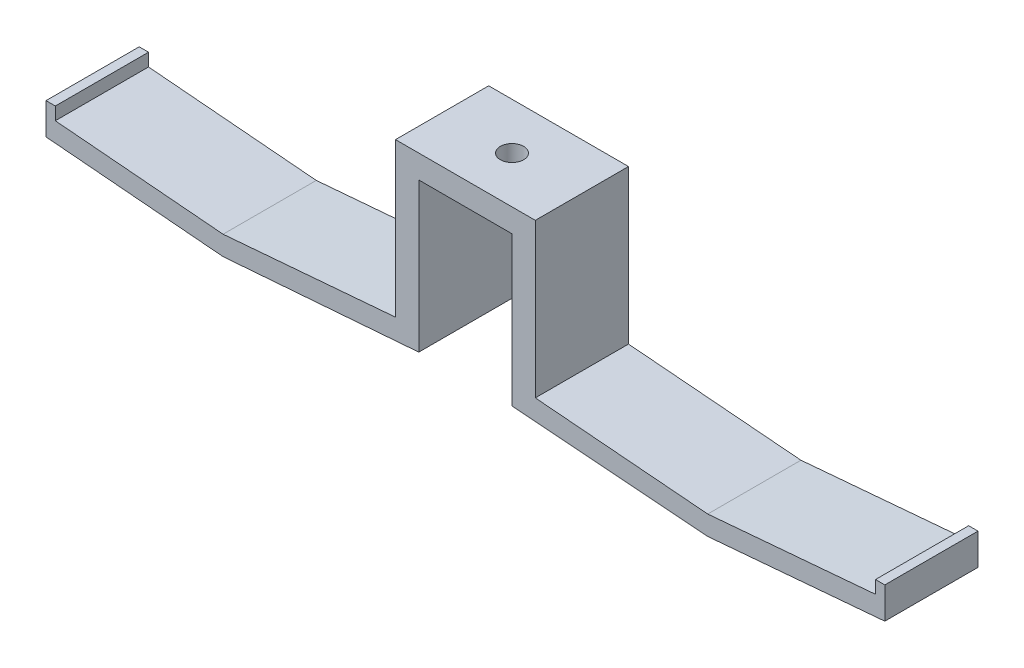
ISO-10303-21;
HEADER;
FILE_DESCRIPTION(('STEP AP214'),'2;1');
FILE_NAME('part.step','',(''),(''),'','','');
FILE_SCHEMA(('AUTOMOTIVE_DESIGN { 1 0 10303 214 1 1 1 1 }'));
ENDSEC;
DATA;
#1=APPLICATION_CONTEXT('core data for automotive mechanical design processes');
#2=APPLICATION_PROTOCOL_DEFINITION('international standard','automotive_design',2000,#1);
#3=PRODUCT_CONTEXT('',#1,'mechanical');
#4=PRODUCT('Part','Part','',(#3));
#5=PRODUCT_RELATED_PRODUCT_CATEGORY('part','',(#4));
#6=PRODUCT_DEFINITION_FORMATION('','',#4);
#7=PRODUCT_DEFINITION_CONTEXT('part definition',#1,'design');
#8=PRODUCT_DEFINITION('design','',#6,#7);
#9=PRODUCT_DEFINITION_SHAPE('','',#8);
#10=(LENGTH_UNIT() NAMED_UNIT(*) SI_UNIT(.MILLI.,.METRE.));
#11=(NAMED_UNIT(*) PLANE_ANGLE_UNIT() SI_UNIT($,.RADIAN.));
#12=(NAMED_UNIT(*) SI_UNIT($,.STERADIAN.) SOLID_ANGLE_UNIT());
#13=UNCERTAINTY_MEASURE_WITH_UNIT(LENGTH_MEASURE(1.E-05),#10,'distance_accuracy_value','');
#14=(GEOMETRIC_REPRESENTATION_CONTEXT(3) GLOBAL_UNCERTAINTY_ASSIGNED_CONTEXT((#13)) GLOBAL_UNIT_ASSIGNED_CONTEXT((#10,
#11,#12)) REPRESENTATION_CONTEXT('',''));
#15=CARTESIAN_POINT('',(0.,0.,0.));
#16=DIRECTION('',(0.,0.,1.));
#17=DIRECTION('',(1.,0.,0.));
#18=AXIS2_PLACEMENT_3D('',#15,#16,#17);
#19=CARTESIAN_POINT('',(-2.81151729848974,-33.7382068524024,25.4));
#20=DIRECTION('',(0.0830454816369341,0.99654575809628,0.));
#21=DIRECTION('',(-0.99654575809628,0.0830454816369341,0.));
#22=AXIS2_PLACEMENT_3D('',#19,#20,#21);
#23=PLANE('',#22);
#24=DIRECTION('',(0.99654575809628,-0.0830454816369341,0.));
#25=VECTOR('',#24,1.);
#26=CARTESIAN_POINT('',(-2.81151729848974,-33.7382068524024,0.));
#27=LINE('',#26,#25);
#28=CARTESIAN_POINT('',(19.05,-35.56,0.));
#29=VERTEX_POINT('',#28);
#30=CARTESIAN_POINT('',(66.04,-39.475833418,0.));
#31=VERTEX_POINT('',#30);
#32=EDGE_CURVE('E202',#29,#31,#27,.T.);
#33=ORIENTED_EDGE('',*,*,#32,.F.);
#34=DIRECTION('',(0.,0.,-1.));
#35=VECTOR('',#34,1.);
#36=CARTESIAN_POINT('',(19.05,-35.56,25.4));
#37=LINE('',#36,#35);
#38=CARTESIAN_POINT('',(19.05,-35.56,25.4));
#39=VERTEX_POINT('',#38);
#40=EDGE_CURVE('E11',#39,#29,#37,.T.);
#41=ORIENTED_EDGE('',*,*,#40,.F.);
#42=DIRECTION('',(0.99654575809628,-0.0830454816369341,0.));
#43=VECTOR('',#42,1.);
#44=CARTESIAN_POINT('',(-2.81151729848974,-33.7382068524024,25.4));
#45=LINE('',#44,#43);
#46=CARTESIAN_POINT('',(66.04,-39.475833418,25.4));
#47=VERTEX_POINT('',#46);
#48=EDGE_CURVE('E252',#39,#47,#45,.T.);
#49=ORIENTED_EDGE('',*,*,#48,.T.);
#50=DIRECTION('',(0.,0.,-1.));
#51=VECTOR('',#50,1.);
#52=CARTESIAN_POINT('',(66.04,-39.475833418,25.4));
#53=LINE('',#52,#51);
#54=EDGE_CURVE('E125',#47,#31,#53,.T.);
#55=ORIENTED_EDGE('',*,*,#54,.T.);
#56=EDGE_LOOP('',(#33,#41,#49,#55));
#57=FACE_BOUND('',#56,.T.);
#58=ADVANCED_FACE('F38',(#57),#23,.T.);
#59=CARTESIAN_POINT('',(19.05,0.,25.4));
#60=DIRECTION('',(1.,0.,0.));
#61=DIRECTION('',(0.,1.,0.));
#62=AXIS2_PLACEMENT_3D('',#59,#60,#61);
#63=PLANE('',#62);
#64=DIRECTION('',(0.,-1.,0.));
#65=VECTOR('',#64,1.);
#66=CARTESIAN_POINT('',(19.05,0.,0.));
#67=LINE('',#66,#65);
#68=CARTESIAN_POINT('',(19.05,6.35,0.));
#69=VERTEX_POINT('',#68);
#70=EDGE_CURVE('E205',#69,#29,#67,.T.);
#71=ORIENTED_EDGE('',*,*,#70,.F.);
#72=DIRECTION('',(0.,0.,-1.));
#73=VECTOR('',#72,1.);
#74=CARTESIAN_POINT('',(19.05,6.35,25.4));
#75=LINE('',#74,#73);
#76=CARTESIAN_POINT('',(19.05,6.35,25.4));
#77=VERTEX_POINT('',#76);
#78=EDGE_CURVE('E46',#77,#69,#75,.T.);
#79=ORIENTED_EDGE('',*,*,#78,.F.);
#80=DIRECTION('',(0.,-1.,0.));
#81=VECTOR('',#80,1.);
#82=CARTESIAN_POINT('',(19.05,0.,25.4));
#83=LINE('',#82,#81);
#84=EDGE_CURVE('E303',#77,#39,#83,.T.);
#85=ORIENTED_EDGE('',*,*,#84,.T.);
#86=ORIENTED_EDGE('',*,*,#40,.T.);
#87=EDGE_LOOP('',(#71,#79,#85,#86));
#88=FACE_BOUND('',#87,.T.);
#89=ADVANCED_FACE('F302',(#88),#63,.T.);
#90=CARTESIAN_POINT('',(0.,6.35,25.4));
#91=DIRECTION('',(0.,-1.,0.));
#92=DIRECTION('',(1.,0.,0.));
#93=AXIS2_PLACEMENT_3D('',#90,#91,#92);
#94=PLANE('',#93);
#95=CARTESIAN_POINT('',(0.,6.35,12.7));
#96=DIRECTION('',(0.,1.,0.));
#97=DIRECTION('',(-1.,0.,0.));
#98=AXIS2_PLACEMENT_3D('',#95,#96,#97);
#99=CIRCLE('',#98,3.175);
#100=CARTESIAN_POINT('',(-3.17499999999998,6.35,12.7));
#101=VERTEX_POINT('',#100);
#102=EDGE_CURVE('E206',#101,#101,#99,.T.);
#103=ORIENTED_EDGE('',*,*,#102,.F.);
#104=EDGE_LOOP('',(#103));
#105=FACE_BOUND('',#104,.T.);
#106=DIRECTION('',(-1.,0.,0.));
#107=VECTOR('',#106,1.);
#108=CARTESIAN_POINT('',(0.,6.35,0.));
#109=LINE('',#108,#107);
#110=CARTESIAN_POINT('',(-19.05,6.35,0.));
#111=VERTEX_POINT('',#110);
#112=EDGE_CURVE('E209',#69,#111,#109,.T.);
#113=ORIENTED_EDGE('',*,*,#112,.T.);
#114=DIRECTION('',(0.,0.,-1.));
#115=VECTOR('',#114,1.);
#116=CARTESIAN_POINT('',(-19.05,6.35,25.4));
#117=LINE('',#116,#115);
#118=CARTESIAN_POINT('',(-19.05,6.35,25.4));
#119=VERTEX_POINT('',#118);
#120=EDGE_CURVE('E286',#119,#111,#117,.T.);
#121=ORIENTED_EDGE('',*,*,#120,.F.);
#122=DIRECTION('',(-1.,0.,0.));
#123=VECTOR('',#122,1.);
#124=CARTESIAN_POINT('',(0.,6.35,25.4));
#125=LINE('',#124,#123);
#126=EDGE_CURVE('E293',#77,#119,#125,.T.);
#127=ORIENTED_EDGE('',*,*,#126,.F.);
#128=ORIENTED_EDGE('',*,*,#78,.T.);
#129=EDGE_LOOP('',(#113,#121,#127,#128));
#130=FACE_BOUND('',#129,.T.);
#131=ADVANCED_FACE('F291',(#105,#130),#94,.F.);
#132=CARTESIAN_POINT('',(-19.05,0.,25.4));
#133=DIRECTION('',(1.,0.,0.));
#134=DIRECTION('',(0.,1.,0.));
#135=AXIS2_PLACEMENT_3D('',#132,#133,#134);
#136=PLANE('',#135);
#137=DIRECTION('',(0.,-1.,0.));
#138=VECTOR('',#137,1.);
#139=CARTESIAN_POINT('',(-19.05,0.,0.));
#140=LINE('',#139,#138);
#141=CARTESIAN_POINT('',(-19.05,-35.56,0.));
#142=VERTEX_POINT('',#141);
#143=EDGE_CURVE('E211',#111,#142,#140,.T.);
#144=ORIENTED_EDGE('',*,*,#143,.T.);
#145=DIRECTION('',(0.,0.,-1.));
#146=VECTOR('',#145,1.);
#147=CARTESIAN_POINT('',(-19.05,-35.56,25.4));
#148=LINE('',#147,#146);
#149=CARTESIAN_POINT('',(-19.05,-35.56,25.4));
#150=VERTEX_POINT('',#149);
#151=EDGE_CURVE('E283',#150,#142,#148,.T.);
#152=ORIENTED_EDGE('',*,*,#151,.F.);
#153=DIRECTION('',(0.,-1.,0.));
#154=VECTOR('',#153,1.);
#155=CARTESIAN_POINT('',(-19.05,0.,25.4));
#156=LINE('',#155,#154);
#157=EDGE_CURVE('E314',#119,#150,#156,.T.);
#158=ORIENTED_EDGE('',*,*,#157,.F.);
#159=ORIENTED_EDGE('',*,*,#120,.T.);
#160=EDGE_LOOP('',(#144,#152,#158,#159));
#161=FACE_BOUND('',#160,.T.);
#162=ADVANCED_FACE('F404',(#161),#136,.F.);
#163=CARTESIAN_POINT('',(2.81151729848975,-33.7382068524024,25.4));
#164=DIRECTION('',(0.0830454816369343,-0.99654575809628,0.));
#165=DIRECTION('',(0.99654575809628,0.0830454816369343,0.));
#166=AXIS2_PLACEMENT_3D('',#163,#164,#165);
#167=PLANE('',#166);
#168=DIRECTION('',(-0.99654575809628,-0.0830454816369343,0.));
#169=VECTOR('',#168,1.);
#170=CARTESIAN_POINT('',(2.81151729848975,-33.7382068524024,0.));
#171=LINE('',#170,#169);
#172=CARTESIAN_POINT('',(-66.04,-39.475833418,0.));
#173=VERTEX_POINT('',#172);
#174=EDGE_CURVE('E213',#142,#173,#171,.T.);
#175=ORIENTED_EDGE('',*,*,#174,.T.);
#176=DIRECTION('',(0.,0.,-1.));
#177=VECTOR('',#176,1.);
#178=CARTESIAN_POINT('',(-66.04,-39.475833418,25.4));
#179=LINE('',#178,#177);
#180=CARTESIAN_POINT('',(-66.04,-39.475833418,25.4));
#181=VERTEX_POINT('',#180);
#182=EDGE_CURVE('E281',#181,#173,#179,.T.);
#183=ORIENTED_EDGE('',*,*,#182,.F.);
#184=DIRECTION('',(-0.99654575809628,-0.0830454816369343,0.));
#185=VECTOR('',#184,1.);
#186=CARTESIAN_POINT('',(2.81151729848975,-33.7382068524024,25.4));
#187=LINE('',#186,#185);
#188=EDGE_CURVE('E316',#150,#181,#187,.T.);
#189=ORIENTED_EDGE('',*,*,#188,.F.);
#190=ORIENTED_EDGE('',*,*,#151,.T.);
#191=EDGE_LOOP('',(#175,#183,#189,#190));
#192=FACE_BOUND('',#191,.T.);
#193=ADVANCED_FACE('F400',(#192),#167,.F.);
#194=CARTESIAN_POINT('',(-3.83732638278315,-44.8033773383684,25.4));
#195=DIRECTION('',(0.0853357272861369,0.996352253798096,0.));
#196=DIRECTION('',(-0.996352253798096,0.0853357272861369,0.));
#197=AXIS2_PLACEMENT_3D('',#194,#195,#196);
#198=PLANE('',#197);
#199=DIRECTION('',(0.996352253798096,-0.0853357272861369,0.));
#200=VECTOR('',#199,1.);
#201=CARTESIAN_POINT('',(-3.83732638278315,-44.8033773383684,0.));
#202=LINE('',#201,#200);
#203=CARTESIAN_POINT('',(-111.76,-35.56,0.));
#204=VERTEX_POINT('',#203);
#205=EDGE_CURVE('E216',#204,#173,#202,.T.);
#206=ORIENTED_EDGE('',*,*,#205,.F.);
#207=DIRECTION('',(0.,0.,-1.));
#208=VECTOR('',#207,1.);
#209=CARTESIAN_POINT('',(-111.76,-35.56,25.4));
#210=LINE('',#209,#208);
#211=CARTESIAN_POINT('',(-111.76,-35.56,25.4));
#212=VERTEX_POINT('',#211);
#213=EDGE_CURVE('E279',#212,#204,#210,.T.);
#214=ORIENTED_EDGE('',*,*,#213,.F.);
#215=DIRECTION('',(0.996352253798096,-0.0853357272861369,0.));
#216=VECTOR('',#215,1.);
#217=CARTESIAN_POINT('',(-3.83732638278315,-44.8033773383684,25.4));
#218=LINE('',#217,#216);
#219=EDGE_CURVE('E318',#212,#181,#218,.T.);
#220=ORIENTED_EDGE('',*,*,#219,.T.);
#221=ORIENTED_EDGE('',*,*,#182,.T.);
#222=EDGE_LOOP('',(#206,#214,#220,#221));
#223=FACE_BOUND('',#222,.T.);
#224=ADVANCED_FACE('F395',(#223),#198,.T.);
#225=CARTESIAN_POINT('',(-111.76,-8.89676213870077E-13,25.4));
#226=DIRECTION('',(1.,0.,0.));
#227=DIRECTION('',(0.,1.,0.));
#228=AXIS2_PLACEMENT_3D('',#225,#226,#227);
#229=PLANE('',#228);
#230=DIRECTION('',(0.,-1.,0.));
#231=VECTOR('',#230,1.);
#232=CARTESIAN_POINT('',(-111.76,-8.89676213870077E-13,0.));
#233=LINE('',#232,#231);
#234=CARTESIAN_POINT('',(-111.76,-32.073379719,0.));
#235=VERTEX_POINT('',#234);
#236=EDGE_CURVE('E219',#235,#204,#233,.T.);
#237=ORIENTED_EDGE('',*,*,#236,.F.);
#238=DIRECTION('',(0.,0.,-1.));
#239=VECTOR('',#238,1.);
#240=CARTESIAN_POINT('',(-111.76,-32.073379719,25.4));
#241=LINE('',#240,#239);
#242=CARTESIAN_POINT('',(-111.76,-32.073379719,25.4));
#243=VERTEX_POINT('',#242);
#244=EDGE_CURVE('E277',#243,#235,#241,.T.);
#245=ORIENTED_EDGE('',*,*,#244,.F.);
#246=DIRECTION('',(0.,-1.,0.));
#247=VECTOR('',#246,1.);
#248=CARTESIAN_POINT('',(-111.76,-8.89676213870077E-13,25.4));
#249=LINE('',#248,#247);
#250=EDGE_CURVE('E321',#243,#212,#249,.T.);
#251=ORIENTED_EDGE('',*,*,#250,.T.);
#252=ORIENTED_EDGE('',*,*,#213,.T.);
#253=EDGE_LOOP('',(#237,#245,#251,#252));
#254=FACE_BOUND('',#253,.T.);
#255=ADVANCED_FACE('F392',(#254),#229,.T.);
#256=CARTESIAN_POINT('',(0.,-32.073379719,25.4));
#257=DIRECTION('',(0.,1.,0.));
#258=DIRECTION('',(0.,0.,1.));
#259=AXIS2_PLACEMENT_3D('',#256,#257,#258);
#260=PLANE('',#259);
#261=DIRECTION('',(1.,0.,0.));
#262=VECTOR('',#261,1.);
#263=CARTESIAN_POINT('',(0.,-32.073379719,0.));
#264=LINE('',#263,#262);
#265=CARTESIAN_POINT('',(-114.3,-32.073379719,0.));
#266=VERTEX_POINT('',#265);
#267=EDGE_CURVE('E222',#266,#235,#264,.T.);
#268=ORIENTED_EDGE('',*,*,#267,.F.);
#269=DIRECTION('',(0.,0.,-1.));
#270=VECTOR('',#269,1.);
#271=CARTESIAN_POINT('',(-114.3,-32.073379719,25.4));
#272=LINE('',#271,#270);
#273=CARTESIAN_POINT('',(-114.3,-32.073379719,25.4));
#274=VERTEX_POINT('',#273);
#275=EDGE_CURVE('E275',#274,#266,#272,.T.);
#276=ORIENTED_EDGE('',*,*,#275,.F.);
#277=DIRECTION('',(1.,0.,0.));
#278=VECTOR('',#277,1.);
#279=CARTESIAN_POINT('',(0.,-32.073379719,25.4));
#280=LINE('',#279,#278);
#281=EDGE_CURVE('E324',#274,#243,#280,.T.);
#282=ORIENTED_EDGE('',*,*,#281,.T.);
#283=ORIENTED_EDGE('',*,*,#244,.T.);
#284=EDGE_LOOP('',(#268,#276,#282,#283));
#285=FACE_BOUND('',#284,.T.);
#286=ADVANCED_FACE('F388',(#285),#260,.T.);
#287=CARTESIAN_POINT('',(-114.3,0.,25.4));
#288=DIRECTION('',(-1.,0.,0.));
#289=DIRECTION('',(0.,0.,1.));
#290=AXIS2_PLACEMENT_3D('',#287,#288,#289);
#291=PLANE('',#290);
#292=DIRECTION('',(0.,1.,0.));
#293=VECTOR('',#292,1.);
#294=CARTESIAN_POINT('',(-114.3,0.,0.));
#295=LINE('',#294,#293);
#296=CARTESIAN_POINT('',(-114.3,-40.64,0.));
#297=VERTEX_POINT('',#296);
#298=EDGE_CURVE('E225',#297,#266,#295,.T.);
#299=ORIENTED_EDGE('',*,*,#298,.F.);
#300=DIRECTION('',(0.,0.,-1.));
#301=VECTOR('',#300,1.);
#302=CARTESIAN_POINT('',(-114.3,-40.64,25.4));
#303=LINE('',#302,#301);
#304=CARTESIAN_POINT('',(-114.3,-40.64,25.4));
#305=VERTEX_POINT('',#304);
#306=EDGE_CURVE('E273',#305,#297,#303,.T.);
#307=ORIENTED_EDGE('',*,*,#306,.F.);
#308=DIRECTION('',(0.,1.,0.));
#309=VECTOR('',#308,1.);
#310=CARTESIAN_POINT('',(-114.3,0.,25.4));
#311=LINE('',#310,#309);
#312=EDGE_CURVE('E327',#305,#274,#311,.T.);
#313=ORIENTED_EDGE('',*,*,#312,.T.);
#314=ORIENTED_EDGE('',*,*,#275,.T.);
#315=EDGE_LOOP('',(#299,#307,#313,#314));
#316=FACE_BOUND('',#315,.T.);
#317=ADVANCED_FACE('F384',(#316),#291,.T.);
#318=CARTESIAN_POINT('',(-4.28774731270794,-50.0623459199991,25.4));
#319=DIRECTION('',(-0.0853357272861369,-0.996352253798096,0.));
#320=DIRECTION('',(0.996352253798096,-0.0853357272861369,0.));
#321=AXIS2_PLACEMENT_3D('',#318,#319,#320);
#322=PLANE('',#321);
#323=DIRECTION('',(-0.996352253798096,0.085335727286137,0.));
#324=VECTOR('',#323,1.);
#325=CARTESIAN_POINT('',(-4.28774731270794,-50.0623459199991,0.));
#326=LINE('',#325,#324);
#327=CARTESIAN_POINT('',(-66.04,-44.773379719,0.));
#328=VERTEX_POINT('',#327);
#329=EDGE_CURVE('E228',#328,#297,#326,.T.);
#330=ORIENTED_EDGE('',*,*,#329,.F.);
#331=DIRECTION('',(0.,0.,-1.));
#332=VECTOR('',#331,1.);
#333=CARTESIAN_POINT('',(-66.04,-44.773379719,25.4));
#334=LINE('',#333,#332);
#335=CARTESIAN_POINT('',(-66.04,-44.773379719,25.4));
#336=VERTEX_POINT('',#335);
#337=EDGE_CURVE('E271',#336,#328,#334,.T.);
#338=ORIENTED_EDGE('',*,*,#337,.F.);
#339=DIRECTION('',(-0.996352253798096,0.085335727286137,0.));
#340=VECTOR('',#339,1.);
#341=CARTESIAN_POINT('',(-4.28774731270794,-50.0623459199991,25.4));
#342=LINE('',#341,#340);
#343=EDGE_CURVE('E330',#336,#305,#342,.T.);
#344=ORIENTED_EDGE('',*,*,#343,.T.);
#345=ORIENTED_EDGE('',*,*,#306,.T.);
#346=EDGE_LOOP('',(#330,#338,#344,#345));
#347=FACE_BOUND('',#346,.T.);
#348=ADVANCED_FACE('F380',(#347),#322,.T.);
#349=CARTESIAN_POINT('',(3.05463693139705,-39.419154541199,25.4));
#350=DIRECTION('',(0.0772595631880114,-0.997011012926135,0.));
#351=DIRECTION('',(0.997011012926135,0.0772595631880114,0.));
#352=AXIS2_PLACEMENT_3D('',#349,#350,#351);
#353=PLANE('',#352);
#354=DIRECTION('',(-0.997011012926135,-0.0772595631880114,0.));
#355=VECTOR('',#354,1.);
#356=CARTESIAN_POINT('',(3.05463693139705,-39.419154541199,0.));
#357=LINE('',#356,#355);
#358=CARTESIAN_POINT('',(-12.7,-40.64,0.));
#359=VERTEX_POINT('',#358);
#360=EDGE_CURVE('E231',#359,#328,#357,.T.);
#361=ORIENTED_EDGE('',*,*,#360,.F.);
#362=DIRECTION('',(0.,0.,-1.));
#363=VECTOR('',#362,1.);
#364=CARTESIAN_POINT('',(-12.7,-40.64,25.4));
#365=LINE('',#364,#363);
#366=CARTESIAN_POINT('',(-12.7,-40.64,25.4));
#367=VERTEX_POINT('',#366);
#368=EDGE_CURVE('E269',#367,#359,#365,.T.);
#369=ORIENTED_EDGE('',*,*,#368,.F.);
#370=DIRECTION('',(-0.997011012926135,-0.0772595631880114,0.));
#371=VECTOR('',#370,1.);
#372=CARTESIAN_POINT('',(3.05463693139705,-39.419154541199,25.4));
#373=LINE('',#372,#371);
#374=EDGE_CURVE('E333',#367,#336,#373,.T.);
#375=ORIENTED_EDGE('',*,*,#374,.T.);
#376=ORIENTED_EDGE('',*,*,#337,.T.);
#377=EDGE_LOOP('',(#361,#369,#375,#376));
#378=FACE_BOUND('',#377,.T.);
#379=ADVANCED_FACE('F376',(#378),#353,.T.);
#380=CARTESIAN_POINT('',(-12.7,0.,25.4));
#381=DIRECTION('',(1.,0.,0.));
#382=DIRECTION('',(0.,1.,0.));
#383=AXIS2_PLACEMENT_3D('',#380,#381,#382);
#384=PLANE('',#383);
#385=DIRECTION('',(0.,-1.,0.));
#386=VECTOR('',#385,1.);
#387=CARTESIAN_POINT('',(-12.7,0.,0.));
#388=LINE('',#387,#386);
#389=CARTESIAN_POINT('',(-12.7,0.,0.));
#390=VERTEX_POINT('',#389);
#391=EDGE_CURVE('E234',#390,#359,#388,.T.);
#392=ORIENTED_EDGE('',*,*,#391,.F.);
#393=DIRECTION('',(0.,0.,-1.));
#394=VECTOR('',#393,1.);
#395=CARTESIAN_POINT('',(-12.7,0.,25.4));
#396=LINE('',#395,#394);
#397=CARTESIAN_POINT('',(-12.7,0.,25.4));
#398=VERTEX_POINT('',#397);
#399=EDGE_CURVE('E267',#398,#390,#396,.T.);
#400=ORIENTED_EDGE('',*,*,#399,.F.);
#401=DIRECTION('',(0.,-1.,0.));
#402=VECTOR('',#401,1.);
#403=CARTESIAN_POINT('',(-12.7,0.,25.4));
#404=LINE('',#403,#402);
#405=EDGE_CURVE('E336',#398,#367,#404,.T.);
#406=ORIENTED_EDGE('',*,*,#405,.T.);
#407=ORIENTED_EDGE('',*,*,#368,.T.);
#408=EDGE_LOOP('',(#392,#400,#406,#407));
#409=FACE_BOUND('',#408,.T.);
#410=ADVANCED_FACE('F372',(#409),#384,.T.);
#411=CARTESIAN_POINT('',(0.,0.,25.4));
#412=DIRECTION('',(0.,-1.,0.));
#413=DIRECTION('',(0.,0.,-1.));
#414=AXIS2_PLACEMENT_3D('',#411,#412,#413);
#415=PLANE('',#414);
#416=CARTESIAN_POINT('',(0.,0.,12.7));
#417=DIRECTION('',(0.,-1.,0.));
#418=DIRECTION('',(0.,0.,-1.));
#419=AXIS2_PLACEMENT_3D('',#416,#417,#418);
#420=CIRCLE('',#419,3.175);
#421=CARTESIAN_POINT('',(0.,0.,9.525));
#422=VERTEX_POINT('',#421);
#423=EDGE_CURVE('E310',#422,#422,#420,.F.);
#424=ORIENTED_EDGE('',*,*,#423,.T.);
#425=EDGE_LOOP('',(#424));
#426=FACE_BOUND('',#425,.T.);
#427=DIRECTION('',(-1.,0.,0.));
#428=VECTOR('',#427,1.);
#429=CARTESIAN_POINT('',(0.,0.,0.));
#430=LINE('',#429,#428);
#431=CARTESIAN_POINT('',(12.7,0.,0.));
#432=VERTEX_POINT('',#431);
#433=EDGE_CURVE('E237',#432,#390,#430,.T.);
#434=ORIENTED_EDGE('',*,*,#433,.F.);
#435=DIRECTION('',(0.,0.,-1.));
#436=VECTOR('',#435,1.);
#437=CARTESIAN_POINT('',(12.7,0.,25.4));
#438=LINE('',#437,#436);
#439=CARTESIAN_POINT('',(12.7,0.,25.4));
#440=VERTEX_POINT('',#439);
#441=EDGE_CURVE('E265',#440,#432,#438,.T.);
#442=ORIENTED_EDGE('',*,*,#441,.F.);
#443=DIRECTION('',(-1.,0.,0.));
#444=VECTOR('',#443,1.);
#445=CARTESIAN_POINT('',(0.,0.,25.4));
#446=LINE('',#445,#444);
#447=EDGE_CURVE('E339',#440,#398,#446,.T.);
#448=ORIENTED_EDGE('',*,*,#447,.T.);
#449=ORIENTED_EDGE('',*,*,#399,.T.);
#450=EDGE_LOOP('',(#434,#442,#448,#449));
#451=FACE_BOUND('',#450,.T.);
#452=ADVANCED_FACE('F368',(#426,#451),#415,.T.);
#453=CARTESIAN_POINT('',(12.7,0.,25.4));
#454=DIRECTION('',(1.,0.,0.));
#455=DIRECTION('',(0.,1.,0.));
#456=AXIS2_PLACEMENT_3D('',#453,#454,#455);
#457=PLANE('',#456);
#458=DIRECTION('',(0.,-1.,0.));
#459=VECTOR('',#458,1.);
#460=CARTESIAN_POINT('',(12.7,0.,0.));
#461=LINE('',#460,#459);
#462=CARTESIAN_POINT('',(12.7,-40.64,0.));
#463=VERTEX_POINT('',#462);
#464=EDGE_CURVE('E240',#432,#463,#461,.T.);
#465=ORIENTED_EDGE('',*,*,#464,.T.);
#466=DIRECTION('',(0.,0.,-1.));
#467=VECTOR('',#466,1.);
#468=CARTESIAN_POINT('',(12.7,-40.64,25.4));
#469=LINE('',#468,#467);
#470=CARTESIAN_POINT('',(12.7,-40.64,25.4));
#471=VERTEX_POINT('',#470);
#472=EDGE_CURVE('E262',#471,#463,#469,.T.);
#473=ORIENTED_EDGE('',*,*,#472,.F.);
#474=DIRECTION('',(0.,-1.,0.));
#475=VECTOR('',#474,1.);
#476=CARTESIAN_POINT('',(12.7,0.,25.4));
#477=LINE('',#476,#475);
#478=EDGE_CURVE('E342',#440,#471,#477,.T.);
#479=ORIENTED_EDGE('',*,*,#478,.F.);
#480=ORIENTED_EDGE('',*,*,#441,.T.);
#481=EDGE_LOOP('',(#465,#473,#479,#480));
#482=FACE_BOUND('',#481,.T.);
#483=ADVANCED_FACE('F365',(#482),#457,.F.);
#484=CARTESIAN_POINT('',(-3.05463693139704,-39.419154541199,25.4));
#485=DIRECTION('',(0.0772595631880112,0.997011012926135,0.));
#486=DIRECTION('',(-0.997011012926135,0.0772595631880112,0.));
#487=AXIS2_PLACEMENT_3D('',#484,#485,#486);
#488=PLANE('',#487);
#489=DIRECTION('',(0.997011012926135,-0.0772595631880112,0.));
#490=VECTOR('',#489,1.);
#491=CARTESIAN_POINT('',(-3.05463693139704,-39.419154541199,0.));
#492=LINE('',#491,#490);
#493=CARTESIAN_POINT('',(66.04,-44.773379719,0.));
#494=VERTEX_POINT('',#493);
#495=EDGE_CURVE('E242',#463,#494,#492,.T.);
#496=ORIENTED_EDGE('',*,*,#495,.T.);
#497=DIRECTION('',(0.,0.,-1.));
#498=VECTOR('',#497,1.);
#499=CARTESIAN_POINT('',(66.04,-44.773379719,25.4));
#500=LINE('',#499,#498);
#501=CARTESIAN_POINT('',(66.04,-44.773379719,25.4));
#502=VERTEX_POINT('',#501);
#503=EDGE_CURVE('E259',#502,#494,#500,.T.);
#504=ORIENTED_EDGE('',*,*,#503,.F.);
#505=DIRECTION('',(0.997011012926135,-0.0772595631880112,0.));
#506=VECTOR('',#505,1.);
#507=CARTESIAN_POINT('',(-3.05463693139704,-39.419154541199,25.4));
#508=LINE('',#507,#506);
#509=EDGE_CURVE('E344',#471,#502,#508,.T.);
#510=ORIENTED_EDGE('',*,*,#509,.F.);
#511=ORIENTED_EDGE('',*,*,#472,.T.);
#512=EDGE_LOOP('',(#496,#504,#510,#511));
#513=FACE_BOUND('',#512,.T.);
#514=ADVANCED_FACE('F361',(#513),#488,.F.);
#515=CARTESIAN_POINT('',(4.28774731270796,-50.0623459199991,25.4));
#516=DIRECTION('',(-0.0853357272861372,0.996352253798096,0.));
#517=DIRECTION('',(-0.996352253798096,-0.0853357272861372,0.));
#518=AXIS2_PLACEMENT_3D('',#515,#516,#517);
#519=PLANE('',#518);
#520=DIRECTION('',(0.996352253798096,0.0853357272861372,0.));
#521=VECTOR('',#520,1.);
#522=CARTESIAN_POINT('',(4.28774731270796,-50.0623459199991,0.));
#523=LINE('',#522,#521);
#524=CARTESIAN_POINT('',(114.3,-40.64,0.));
#525=VERTEX_POINT('',#524);
#526=EDGE_CURVE('E244',#494,#525,#523,.T.);
#527=ORIENTED_EDGE('',*,*,#526,.T.);
#528=DIRECTION('',(0.,0.,-1.));
#529=VECTOR('',#528,1.);
#530=CARTESIAN_POINT('',(114.3,-40.64,25.4));
#531=LINE('',#530,#529);
#532=CARTESIAN_POINT('',(114.3,-40.64,25.4));
#533=VERTEX_POINT('',#532);
#534=EDGE_CURVE('E256',#533,#525,#531,.T.);
#535=ORIENTED_EDGE('',*,*,#534,.F.);
#536=DIRECTION('',(0.996352253798096,0.0853357272861372,0.));
#537=VECTOR('',#536,1.);
#538=CARTESIAN_POINT('',(4.28774731270796,-50.0623459199991,25.4));
#539=LINE('',#538,#537);
#540=EDGE_CURVE('E346',#502,#533,#539,.T.);
#541=ORIENTED_EDGE('',*,*,#540,.F.);
#542=ORIENTED_EDGE('',*,*,#503,.T.);
#543=EDGE_LOOP('',(#527,#535,#541,#542));
#544=FACE_BOUND('',#543,.T.);
#545=ADVANCED_FACE('F352',(#544),#519,.F.);
#546=CARTESIAN_POINT('',(114.3,0.,25.4));
#547=DIRECTION('',(-1.,0.,0.));
#548=DIRECTION('',(0.,0.,1.));
#549=AXIS2_PLACEMENT_3D('',#546,#547,#548);
#550=PLANE('',#549);
#551=DIRECTION('',(0.,1.,0.));
#552=VECTOR('',#551,1.);
#553=CARTESIAN_POINT('',(114.3,0.,0.));
#554=LINE('',#553,#552);
#555=CARTESIAN_POINT('',(114.3,-32.073379719,0.));
#556=VERTEX_POINT('',#555);
#557=EDGE_CURVE('E246',#525,#556,#554,.T.);
#558=ORIENTED_EDGE('',*,*,#557,.T.);
#559=DIRECTION('',(0.,0.,-1.));
#560=VECTOR('',#559,1.);
#561=CARTESIAN_POINT('',(114.3,-32.073379719,25.4));
#562=LINE('',#561,#560);
#563=CARTESIAN_POINT('',(114.3,-32.073379719,25.4));
#564=VERTEX_POINT('',#563);
#565=EDGE_CURVE('E194',#564,#556,#562,.T.);
#566=ORIENTED_EDGE('',*,*,#565,.F.);
#567=DIRECTION('',(0.,1.,0.));
#568=VECTOR('',#567,1.);
#569=CARTESIAN_POINT('',(114.3,0.,25.4));
#570=LINE('',#569,#568);
#571=EDGE_CURVE('E185',#533,#564,#570,.T.);
#572=ORIENTED_EDGE('',*,*,#571,.F.);
#573=ORIENTED_EDGE('',*,*,#534,.T.);
#574=EDGE_LOOP('',(#558,#566,#572,#573));
#575=FACE_BOUND('',#574,.T.);
#576=ADVANCED_FACE('F356',(#575),#550,.F.);
#577=CARTESIAN_POINT('',(0.,-32.073379719,25.4));
#578=DIRECTION('',(0.,-1.,0.));
#579=DIRECTION('',(0.,0.,-1.));
#580=AXIS2_PLACEMENT_3D('',#577,#578,#579);
#581=PLANE('',#580);
#582=DIRECTION('',(-1.,0.,0.));
#583=VECTOR('',#582,1.);
#584=CARTESIAN_POINT('',(0.,-32.073379719,0.));
#585=LINE('',#584,#583);
#586=CARTESIAN_POINT('',(111.76,-32.073379719,0.));
#587=VERTEX_POINT('',#586);
#588=EDGE_CURVE('E193',#556,#587,#585,.T.);
#589=ORIENTED_EDGE('',*,*,#588,.T.);
#590=DIRECTION('',(0.,0.,-1.));
#591=VECTOR('',#590,1.);
#592=CARTESIAN_POINT('',(111.76,-32.073379719,25.4));
#593=LINE('',#592,#591);
#594=CARTESIAN_POINT('',(111.76,-32.073379719,25.4));
#595=VERTEX_POINT('',#594);
#596=EDGE_CURVE('E190',#595,#587,#593,.T.);
#597=ORIENTED_EDGE('',*,*,#596,.F.);
#598=DIRECTION('',(-1.,0.,0.));
#599=VECTOR('',#598,1.);
#600=CARTESIAN_POINT('',(0.,-32.073379719,25.4));
#601=LINE('',#600,#599);
#602=EDGE_CURVE('E179',#564,#595,#601,.T.);
#603=ORIENTED_EDGE('',*,*,#602,.F.);
#604=ORIENTED_EDGE('',*,*,#565,.T.);
#605=EDGE_LOOP('',(#589,#597,#603,#604));
#606=FACE_BOUND('',#605,.T.);
#607=ADVANCED_FACE('F191',(#606),#581,.F.);
#608=CARTESIAN_POINT('',(111.76,0.,25.4));
#609=DIRECTION('',(1.,0.,0.));
#610=DIRECTION('',(0.,0.,-1.));
#611=AXIS2_PLACEMENT_3D('',#608,#609,#610);
#612=PLANE('',#611);
#613=DIRECTION('',(0.,-1.,0.));
#614=VECTOR('',#613,1.);
#615=CARTESIAN_POINT('',(111.76,0.,0.));
#616=LINE('',#615,#614);
#617=CARTESIAN_POINT('',(111.76,-35.56,0.));
#618=VERTEX_POINT('',#617);
#619=EDGE_CURVE('E118',#587,#618,#616,.T.);
#620=ORIENTED_EDGE('',*,*,#619,.T.);
#621=DIRECTION('',(0.,0.,-1.));
#622=VECTOR('',#621,1.);
#623=CARTESIAN_POINT('',(111.76,-35.56,25.4));
#624=LINE('',#623,#622);
#625=CARTESIAN_POINT('',(111.76,-35.56,25.4));
#626=VERTEX_POINT('',#625);
#627=EDGE_CURVE('E195',#626,#618,#624,.T.);
#628=ORIENTED_EDGE('',*,*,#627,.F.);
#629=DIRECTION('',(0.,-1.,0.));
#630=VECTOR('',#629,1.);
#631=CARTESIAN_POINT('',(111.76,0.,25.4));
#632=LINE('',#631,#630);
#633=EDGE_CURVE('E183',#595,#626,#632,.T.);
#634=ORIENTED_EDGE('',*,*,#633,.F.);
#635=ORIENTED_EDGE('',*,*,#596,.T.);
#636=EDGE_LOOP('',(#620,#628,#634,#635));
#637=FACE_BOUND('',#636,.T.);
#638=ADVANCED_FACE('F197',(#637),#612,.F.);
#639=CARTESIAN_POINT('',(3.83732638278317,-44.8033773383684,25.4));
#640=DIRECTION('',(0.0853357272861372,-0.996352253798096,0.));
#641=DIRECTION('',(0.996352253798096,0.0853357272861372,0.));
#642=AXIS2_PLACEMENT_3D('',#639,#640,#641);
#643=PLANE('',#642);
#644=DIRECTION('',(-0.996352253798096,-0.0853357272861372,0.));
#645=VECTOR('',#644,1.);
#646=CARTESIAN_POINT('',(3.83732638278317,-44.8033773383684,0.));
#647=LINE('',#646,#645);
#648=EDGE_CURVE('E250',#618,#31,#647,.T.);
#649=ORIENTED_EDGE('',*,*,#648,.T.);
#650=ORIENTED_EDGE('',*,*,#54,.F.);
#651=DIRECTION('',(-0.996352253798096,-0.0853357272861372,0.));
#652=VECTOR('',#651,1.);
#653=CARTESIAN_POINT('',(3.83732638278317,-44.8033773383684,25.4));
#654=LINE('',#653,#652);
#655=EDGE_CURVE('E54',#626,#47,#654,.T.);
#656=ORIENTED_EDGE('',*,*,#655,.F.);
#657=ORIENTED_EDGE('',*,*,#627,.T.);
#658=EDGE_LOOP('',(#649,#650,#656,#657));
#659=FACE_BOUND('',#658,.T.);
#660=ADVANCED_FACE('F306',(#659),#643,.F.);
#661=CARTESIAN_POINT('',(0.,0.,25.4));
#662=DIRECTION('',(0.,0.,1.));
#663=DIRECTION('',(1.,0.,0.));
#664=AXIS2_PLACEMENT_3D('',#661,#662,#663);
#665=PLANE('',#664);
#666=ORIENTED_EDGE('',*,*,#48,.F.);
#667=ORIENTED_EDGE('',*,*,#84,.F.);
#668=ORIENTED_EDGE('',*,*,#126,.T.);
#669=ORIENTED_EDGE('',*,*,#157,.T.);
#670=ORIENTED_EDGE('',*,*,#188,.T.);
#671=ORIENTED_EDGE('',*,*,#219,.F.);
#672=ORIENTED_EDGE('',*,*,#250,.F.);
#673=ORIENTED_EDGE('',*,*,#281,.F.);
#674=ORIENTED_EDGE('',*,*,#312,.F.);
#675=ORIENTED_EDGE('',*,*,#343,.F.);
#676=ORIENTED_EDGE('',*,*,#374,.F.);
#677=ORIENTED_EDGE('',*,*,#405,.F.);
#678=ORIENTED_EDGE('',*,*,#447,.F.);
#679=ORIENTED_EDGE('',*,*,#478,.T.);
#680=ORIENTED_EDGE('',*,*,#509,.T.);
#681=ORIENTED_EDGE('',*,*,#540,.T.);
#682=ORIENTED_EDGE('',*,*,#571,.T.);
#683=ORIENTED_EDGE('',*,*,#602,.T.);
#684=ORIENTED_EDGE('',*,*,#633,.T.);
#685=ORIENTED_EDGE('',*,*,#655,.T.);
#686=EDGE_LOOP('',(#666,#667,#668,#669,#670,#671,#672,#673,#674,#675,#676,#677,#678,#679,#680,
#681,#682,#683,#684,#685));
#687=FACE_BOUND('',#686,.T.);
#688=ADVANCED_FACE('F181',(#687),#665,.T.);
#689=CARTESIAN_POINT('',(0.,0.,0.));
#690=DIRECTION('',(0.,0.,1.));
#691=DIRECTION('',(1.,0.,0.));
#692=AXIS2_PLACEMENT_3D('',#689,#690,#691);
#693=PLANE('',#692);
#694=ORIENTED_EDGE('',*,*,#32,.T.);
#695=ORIENTED_EDGE('',*,*,#648,.F.);
#696=ORIENTED_EDGE('',*,*,#619,.F.);
#697=ORIENTED_EDGE('',*,*,#588,.F.);
#698=ORIENTED_EDGE('',*,*,#557,.F.);
#699=ORIENTED_EDGE('',*,*,#526,.F.);
#700=ORIENTED_EDGE('',*,*,#495,.F.);
#701=ORIENTED_EDGE('',*,*,#464,.F.);
#702=ORIENTED_EDGE('',*,*,#433,.T.);
#703=ORIENTED_EDGE('',*,*,#391,.T.);
#704=ORIENTED_EDGE('',*,*,#360,.T.);
#705=ORIENTED_EDGE('',*,*,#329,.T.);
#706=ORIENTED_EDGE('',*,*,#298,.T.);
#707=ORIENTED_EDGE('',*,*,#267,.T.);
#708=ORIENTED_EDGE('',*,*,#236,.T.);
#709=ORIENTED_EDGE('',*,*,#205,.T.);
#710=ORIENTED_EDGE('',*,*,#174,.F.);
#711=ORIENTED_EDGE('',*,*,#143,.F.);
#712=ORIENTED_EDGE('',*,*,#112,.F.);
#713=ORIENTED_EDGE('',*,*,#70,.T.);
#714=EDGE_LOOP('',(#694,#695,#696,#697,#698,#699,#700,#701,#702,#703,#704,#705,#706,#707,#708,
#709,#710,#711,#712,#713));
#715=FACE_BOUND('',#714,.T.);
#716=ADVANCED_FACE('F300',(#715),#693,.F.);
#717=CARTESIAN_POINT('',(0.,-44.774379719,12.7));
#718=DIRECTION('',(0.,1.,0.));
#719=DIRECTION('',(-1.,0.,0.));
#720=AXIS2_PLACEMENT_3D('',#717,#718,#719);
#721=CYLINDRICAL_SURFACE('',#720,3.175);
#722=ORIENTED_EDGE('',*,*,#423,.F.);
#723=EDGE_LOOP('',(#722));
#724=FACE_BOUND('',#723,.T.);
#725=ORIENTED_EDGE('',*,*,#102,.T.);
#726=EDGE_LOOP('',(#725));
#727=FACE_BOUND('',#726,.T.);
#728=ADVANCED_FACE('F448',(#724,#727),#721,.F.);
#729=CLOSED_SHELL('',(#58,#89,#131,#162,#193,#224,#255,#286,#317,#348,#379,#410,#452,#483,#514,
#545,#576,#607,#638,#660,#688,#716,#728));
#730=MANIFOLD_SOLID_BREP('B2',#729);
#731=ADVANCED_BREP_SHAPE_REPRESENTATION('',(#18,#730),#14);
#732=SHAPE_DEFINITION_REPRESENTATION(#9,#731);
ENDSEC;
END-ISO-10303-21;
